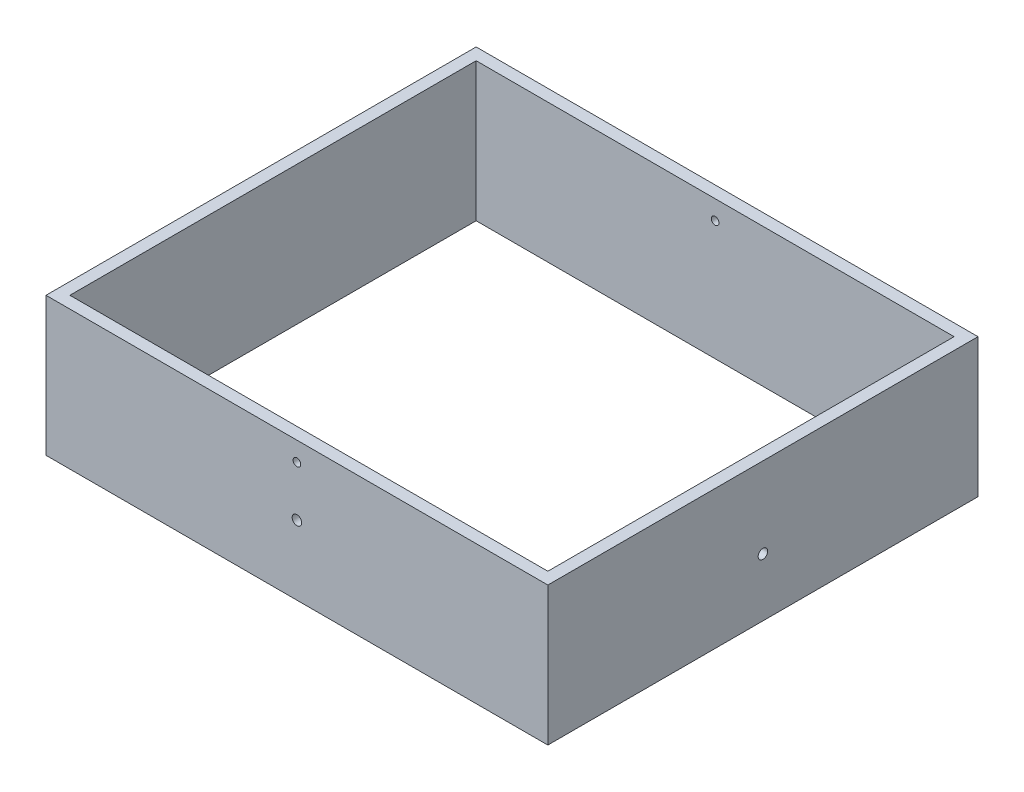
ISO-10303-21;
HEADER;
FILE_DESCRIPTION(('STEP AP214'),'2;1');
FILE_NAME('part.step','',(''),(''),'','','');
FILE_SCHEMA(('AUTOMOTIVE_DESIGN { 1 0 10303 214 1 1 1 1 }'));
ENDSEC;
DATA;
#1=APPLICATION_CONTEXT('core data for automotive mechanical design processes');
#2=APPLICATION_PROTOCOL_DEFINITION('international standard','automotive_design',2000,#1);
#3=PRODUCT_CONTEXT('',#1,'mechanical');
#4=PRODUCT('Part','Part','',(#3));
#5=PRODUCT_RELATED_PRODUCT_CATEGORY('part','',(#4));
#6=PRODUCT_DEFINITION_FORMATION('','',#4);
#7=PRODUCT_DEFINITION_CONTEXT('part definition',#1,'design');
#8=PRODUCT_DEFINITION('design','',#6,#7);
#9=PRODUCT_DEFINITION_SHAPE('','',#8);
#10=(LENGTH_UNIT() NAMED_UNIT(*) SI_UNIT(.MILLI.,.METRE.));
#11=(NAMED_UNIT(*) PLANE_ANGLE_UNIT() SI_UNIT($,.RADIAN.));
#12=(NAMED_UNIT(*) SI_UNIT($,.STERADIAN.) SOLID_ANGLE_UNIT());
#13=UNCERTAINTY_MEASURE_WITH_UNIT(LENGTH_MEASURE(1.E-05),#10,'distance_accuracy_value','');
#14=(GEOMETRIC_REPRESENTATION_CONTEXT(3) GLOBAL_UNCERTAINTY_ASSIGNED_CONTEXT((#13)) GLOBAL_UNIT_ASSIGNED_CONTEXT((#10,
#11,#12)) REPRESENTATION_CONTEXT('',''));
#15=CARTESIAN_POINT('',(0.,0.,0.));
#16=DIRECTION('',(0.,0.,1.));
#17=DIRECTION('',(1.,0.,0.));
#18=AXIS2_PLACEMENT_3D('',#15,#16,#17);
#19=CARTESIAN_POINT('',(0.,92.075,0.));
#20=DIRECTION('',(0.,1.,0.));
#21=DIRECTION('',(0.,0.,1.));
#22=AXIS2_PLACEMENT_3D('',#19,#20,#21);
#23=PLANE('',#22);
#24=DIRECTION('',(0.,0.,1.));
#25=VECTOR('',#24,1.);
#26=CARTESIAN_POINT('',(-118.999851079672,92.075,-72.9694434102755));
#27=LINE('',#26,#25);
#28=CARTESIAN_POINT('',(-118.999851079672,92.075,-72.9694434102755));
#29=VERTEX_POINT('',#28);
#30=CARTESIAN_POINT('',(-118.999851079672,92.075,212.780556589725));
#31=VERTEX_POINT('',#30);
#32=EDGE_CURVE('E155',#29,#31,#27,.T.);
#33=ORIENTED_EDGE('',*,*,#32,.T.);
#34=DIRECTION('',(1.,0.,0.));
#35=VECTOR('',#34,1.);
#36=CARTESIAN_POINT('',(-118.999851079672,92.075,212.780556589725));
#37=LINE('',#36,#35);
#38=CARTESIAN_POINT('',(214.375148920328,92.075,212.780556589725));
#39=VERTEX_POINT('',#38);
#40=EDGE_CURVE('E159',#31,#39,#37,.T.);
#41=ORIENTED_EDGE('',*,*,#40,.T.);
#42=DIRECTION('',(0.,0.,-1.));
#43=VECTOR('',#42,1.);
#44=CARTESIAN_POINT('',(214.375148920328,92.075,-72.9694434102755));
#45=LINE('',#44,#43);
#46=CARTESIAN_POINT('',(214.375148920328,92.075,-72.9694434102755));
#47=VERTEX_POINT('',#46);
#48=EDGE_CURVE('E163',#39,#47,#45,.T.);
#49=ORIENTED_EDGE('',*,*,#48,.T.);
#50=DIRECTION('',(-1.,0.,0.));
#51=VECTOR('',#50,1.);
#52=CARTESIAN_POINT('',(-118.999851079672,92.075,-72.9694434102755));
#53=LINE('',#52,#51);
#54=EDGE_CURVE('E166',#47,#29,#53,.T.);
#55=ORIENTED_EDGE('',*,*,#54,.T.);
#56=EDGE_LOOP('',(#33,#41,#49,#55));
#57=FACE_BOUND('',#56,.T.);
#58=DIRECTION('',(1.,0.,0.));
#59=VECTOR('',#58,1.);
#60=CARTESIAN_POINT('',(-111.062351079672,92.075,204.843056589725));
#61=LINE('',#60,#59);
#62=CARTESIAN_POINT('',(-111.062351079672,92.075,204.843056589725));
#63=VERTEX_POINT('',#62);
#64=CARTESIAN_POINT('',(206.437648920328,92.075,204.843056589725));
#65=VERTEX_POINT('',#64);
#66=EDGE_CURVE('E114',#63,#65,#61,.T.);
#67=ORIENTED_EDGE('',*,*,#66,.F.);
#68=DIRECTION('',(0.,0.,1.));
#69=VECTOR('',#68,1.);
#70=CARTESIAN_POINT('',(-111.062351079672,92.075,-65.0319434102755));
#71=LINE('',#70,#69);
#72=CARTESIAN_POINT('',(-111.062351079672,92.075,-65.0319434102755));
#73=VERTEX_POINT('',#72);
#74=EDGE_CURVE('E105',#73,#63,#71,.T.);
#75=ORIENTED_EDGE('',*,*,#74,.F.);
#76=DIRECTION('',(-1.,0.,0.));
#77=VECTOR('',#76,1.);
#78=CARTESIAN_POINT('',(-111.062351079672,92.075,-65.0319434102755));
#79=LINE('',#78,#77);
#80=CARTESIAN_POINT('',(206.437648920328,92.075,-65.0319434102755));
#81=VERTEX_POINT('',#80);
#82=EDGE_CURVE('E131',#81,#73,#79,.T.);
#83=ORIENTED_EDGE('',*,*,#82,.F.);
#84=DIRECTION('',(0.,0.,-1.));
#85=VECTOR('',#84,1.);
#86=CARTESIAN_POINT('',(206.437648920328,92.075,-65.0319434102755));
#87=LINE('',#86,#85);
#88=EDGE_CURVE('E127',#65,#81,#87,.T.);
#89=ORIENTED_EDGE('',*,*,#88,.F.);
#90=EDGE_LOOP('',(#67,#75,#83,#89));
#91=FACE_BOUND('',#90,.T.);
#92=ADVANCED_FACE('F38',(#57,#91),#23,.T.);
#93=CARTESIAN_POINT('',(0.,0.,0.));
#94=DIRECTION('',(0.,1.,0.));
#95=DIRECTION('',(0.,0.,1.));
#96=AXIS2_PLACEMENT_3D('',#93,#94,#95);
#97=PLANE('',#96);
#98=DIRECTION('',(0.,0.,1.));
#99=VECTOR('',#98,1.);
#100=CARTESIAN_POINT('',(-118.999851079672,0.,-72.9694434102755));
#101=LINE('',#100,#99);
#102=CARTESIAN_POINT('',(-118.999851079672,0.,-72.9694434102755));
#103=VERTEX_POINT('',#102);
#104=CARTESIAN_POINT('',(-118.999851079672,0.,212.780556589725));
#105=VERTEX_POINT('',#104);
#106=EDGE_CURVE('E123',#103,#105,#101,.T.);
#107=ORIENTED_EDGE('',*,*,#106,.F.);
#108=DIRECTION('',(-1.,0.,0.));
#109=VECTOR('',#108,1.);
#110=CARTESIAN_POINT('',(-118.999851079672,0.,-72.9694434102755));
#111=LINE('',#110,#109);
#112=CARTESIAN_POINT('',(214.375148920328,0.,-72.9694434102755));
#113=VERTEX_POINT('',#112);
#114=EDGE_CURVE('E160',#113,#103,#111,.T.);
#115=ORIENTED_EDGE('',*,*,#114,.F.);
#116=DIRECTION('',(0.,0.,-1.));
#117=VECTOR('',#116,1.);
#118=CARTESIAN_POINT('',(214.375148920328,0.,-72.9694434102755));
#119=LINE('',#118,#117);
#120=CARTESIAN_POINT('',(214.375148920328,0.,212.780556589725));
#121=VERTEX_POINT('',#120);
#122=EDGE_CURVE('E176',#121,#113,#119,.T.);
#123=ORIENTED_EDGE('',*,*,#122,.F.);
#124=DIRECTION('',(1.,0.,0.));
#125=VECTOR('',#124,1.);
#126=CARTESIAN_POINT('',(-118.999851079672,0.,212.780556589725));
#127=LINE('',#126,#125);
#128=EDGE_CURVE('E173',#105,#121,#127,.T.);
#129=ORIENTED_EDGE('',*,*,#128,.F.);
#130=EDGE_LOOP('',(#107,#115,#123,#129));
#131=FACE_BOUND('',#130,.T.);
#132=DIRECTION('',(0.,0.,1.));
#133=VECTOR('',#132,1.);
#134=CARTESIAN_POINT('',(-111.062351079672,0.,-65.0319434102755));
#135=LINE('',#134,#133);
#136=CARTESIAN_POINT('',(-111.062351079672,0.,-65.0319434102755));
#137=VERTEX_POINT('',#136);
#138=CARTESIAN_POINT('',(-111.062351079672,0.,204.843056589725));
#139=VERTEX_POINT('',#138);
#140=EDGE_CURVE('E63',#137,#139,#135,.T.);
#141=ORIENTED_EDGE('',*,*,#140,.T.);
#142=DIRECTION('',(1.,0.,0.));
#143=VECTOR('',#142,1.);
#144=CARTESIAN_POINT('',(-111.062351079672,0.,204.843056589725));
#145=LINE('',#144,#143);
#146=CARTESIAN_POINT('',(206.437648920328,0.,204.843056589725));
#147=VERTEX_POINT('',#146);
#148=EDGE_CURVE('E121',#139,#147,#145,.T.);
#149=ORIENTED_EDGE('',*,*,#148,.T.);
#150=DIRECTION('',(0.,0.,-1.));
#151=VECTOR('',#150,1.);
#152=CARTESIAN_POINT('',(206.437648920328,0.,-65.0319434102755));
#153=LINE('',#152,#151);
#154=CARTESIAN_POINT('',(206.437648920328,0.,-65.0319434102755));
#155=VERTEX_POINT('',#154);
#156=EDGE_CURVE('E142',#147,#155,#153,.T.);
#157=ORIENTED_EDGE('',*,*,#156,.T.);
#158=DIRECTION('',(-1.,0.,0.));
#159=VECTOR('',#158,1.);
#160=CARTESIAN_POINT('',(-111.062351079672,0.,-65.0319434102755));
#161=LINE('',#160,#159);
#162=EDGE_CURVE('E115',#155,#137,#161,.T.);
#163=ORIENTED_EDGE('',*,*,#162,.T.);
#164=EDGE_LOOP('',(#141,#149,#157,#163));
#165=FACE_BOUND('',#164,.T.);
#166=ADVANCED_FACE('F200',(#131,#165),#97,.F.);
#167=CARTESIAN_POINT('',(-118.999851079672,92.075,-72.9694434102755));
#168=DIRECTION('',(1.,0.,0.));
#169=DIRECTION('',(0.,0.,-1.));
#170=AXIS2_PLACEMENT_3D('',#167,#168,#169);
#171=PLANE('',#170);
#172=ORIENTED_EDGE('',*,*,#106,.T.);
#173=DIRECTION('',(0.,-1.,0.));
#174=VECTOR('',#173,1.);
#175=CARTESIAN_POINT('',(-118.999851079672,92.075,212.780556589725));
#176=LINE('',#175,#174);
#177=EDGE_CURVE('E11',#31,#105,#176,.T.);
#178=ORIENTED_EDGE('',*,*,#177,.F.);
#179=ORIENTED_EDGE('',*,*,#32,.F.);
#180=DIRECTION('',(0.,-1.,0.));
#181=VECTOR('',#180,1.);
#182=CARTESIAN_POINT('',(-118.999851079672,92.075,-72.9694434102755));
#183=LINE('',#182,#181);
#184=EDGE_CURVE('E169',#29,#103,#183,.T.);
#185=ORIENTED_EDGE('',*,*,#184,.T.);
#186=EDGE_LOOP('',(#172,#178,#179,#185));
#187=FACE_BOUND('',#186,.T.);
#188=ADVANCED_FACE('F40',(#187),#171,.F.);
#189=CARTESIAN_POINT('',(-118.999851079672,92.075,212.780556589725));
#190=DIRECTION('',(0.,0.,-1.));
#191=DIRECTION('',(-1.,0.,0.));
#192=AXIS2_PLACEMENT_3D('',#189,#190,#191);
#193=PLANE('',#192);
#194=CARTESIAN_POINT('',(47.6876489203276,46.0375,212.780556589725));
#195=DIRECTION('',(0.,0.,1.));
#196=DIRECTION('',(1.,0.,0.));
#197=AXIS2_PLACEMENT_3D('',#194,#195,#196);
#198=CIRCLE('',#197,3.175);
#199=CARTESIAN_POINT('',(50.8626489203276,46.0375,212.780556589725));
#200=VERTEX_POINT('',#199);
#201=EDGE_CURVE('E295',#200,#200,#198,.T.);
#202=ORIENTED_EDGE('',*,*,#201,.F.);
#203=EDGE_LOOP('',(#202));
#204=FACE_BOUND('',#203,.T.);
#205=CARTESIAN_POINT('',(47.6876489203276,79.375,212.780556589725));
#206=DIRECTION('',(0.,0.,1.));
#207=DIRECTION('',(1.,0.,0.));
#208=AXIS2_PLACEMENT_3D('',#205,#206,#207);
#209=CIRCLE('',#208,2.54);
#210=CARTESIAN_POINT('',(50.2276489203276,79.375,212.780556589725));
#211=VERTEX_POINT('',#210);
#212=EDGE_CURVE('E244',#211,#211,#209,.T.);
#213=ORIENTED_EDGE('',*,*,#212,.F.);
#214=EDGE_LOOP('',(#213));
#215=FACE_BOUND('',#214,.T.);
#216=ORIENTED_EDGE('',*,*,#128,.T.);
#217=DIRECTION('',(0.,-1.,0.));
#218=VECTOR('',#217,1.);
#219=CARTESIAN_POINT('',(214.375148920328,92.075,212.780556589725));
#220=LINE('',#219,#218);
#221=EDGE_CURVE('E48',#39,#121,#220,.T.);
#222=ORIENTED_EDGE('',*,*,#221,.F.);
#223=ORIENTED_EDGE('',*,*,#40,.F.);
#224=ORIENTED_EDGE('',*,*,#177,.T.);
#225=EDGE_LOOP('',(#216,#222,#223,#224));
#226=FACE_BOUND('',#225,.T.);
#227=ADVANCED_FACE('F210',(#204,#215,#226),#193,.F.);
#228=CARTESIAN_POINT('',(214.375148920328,92.075,-72.9694434102755));
#229=DIRECTION('',(-1.,0.,0.));
#230=DIRECTION('',(0.,0.,1.));
#231=AXIS2_PLACEMENT_3D('',#228,#229,#230);
#232=PLANE('',#231);
#233=CARTESIAN_POINT('',(214.375148920328,38.5595845822467,69.9055565897245));
#234=DIRECTION('',(1.,0.,0.));
#235=DIRECTION('',(0.,0.,-1.));
#236=AXIS2_PLACEMENT_3D('',#233,#234,#235);
#237=CIRCLE('',#236,3.175);
#238=CARTESIAN_POINT('',(214.375148920328,38.5595845822467,66.7305565897245));
#239=VERTEX_POINT('',#238);
#240=EDGE_CURVE('E290',#239,#239,#237,.T.);
#241=ORIENTED_EDGE('',*,*,#240,.F.);
#242=EDGE_LOOP('',(#241));
#243=FACE_BOUND('',#242,.T.);
#244=ORIENTED_EDGE('',*,*,#122,.T.);
#245=DIRECTION('',(0.,-1.,0.));
#246=VECTOR('',#245,1.);
#247=CARTESIAN_POINT('',(214.375148920328,92.075,-72.9694434102755));
#248=LINE('',#247,#246);
#249=EDGE_CURVE('E184',#47,#113,#248,.T.);
#250=ORIENTED_EDGE('',*,*,#249,.F.);
#251=ORIENTED_EDGE('',*,*,#48,.F.);
#252=ORIENTED_EDGE('',*,*,#221,.T.);
#253=EDGE_LOOP('',(#244,#250,#251,#252));
#254=FACE_BOUND('',#253,.T.);
#255=ADVANCED_FACE('F194',(#243,#254),#232,.F.);
#256=CARTESIAN_POINT('',(-118.999851079672,92.075,-72.9694434102755));
#257=DIRECTION('',(0.,0.,1.));
#258=DIRECTION('',(1.,0.,0.));
#259=AXIS2_PLACEMENT_3D('',#256,#257,#258);
#260=PLANE('',#259);
#261=CARTESIAN_POINT('',(47.6876489203276,79.375,-72.9694434102755));
#262=DIRECTION('',(0.,0.,1.));
#263=DIRECTION('',(1.,0.,0.));
#264=AXIS2_PLACEMENT_3D('',#261,#262,#263);
#265=CIRCLE('',#264,2.54);
#266=CARTESIAN_POINT('',(50.2276489203276,79.375,-72.9694434102755));
#267=VERTEX_POINT('',#266);
#268=EDGE_CURVE('E241',#267,#267,#265,.T.);
#269=ORIENTED_EDGE('',*,*,#268,.T.);
#270=EDGE_LOOP('',(#269));
#271=FACE_BOUND('',#270,.T.);
#272=ORIENTED_EDGE('',*,*,#114,.T.);
#273=ORIENTED_EDGE('',*,*,#184,.F.);
#274=ORIENTED_EDGE('',*,*,#54,.F.);
#275=ORIENTED_EDGE('',*,*,#249,.T.);
#276=EDGE_LOOP('',(#272,#273,#274,#275));
#277=FACE_BOUND('',#276,.T.);
#278=ADVANCED_FACE('F204',(#271,#277),#260,.F.);
#279=CARTESIAN_POINT('',(-111.062351079672,92.075,-65.0319434102755));
#280=DIRECTION('',(1.,0.,0.));
#281=DIRECTION('',(0.,0.,-1.));
#282=AXIS2_PLACEMENT_3D('',#279,#280,#281);
#283=PLANE('',#282);
#284=ORIENTED_EDGE('',*,*,#140,.F.);
#285=DIRECTION('',(0.,-1.,0.));
#286=VECTOR('',#285,1.);
#287=CARTESIAN_POINT('',(-111.062351079672,92.075,-65.0319434102755));
#288=LINE('',#287,#286);
#289=EDGE_CURVE('E109',#73,#137,#288,.T.);
#290=ORIENTED_EDGE('',*,*,#289,.F.);
#291=ORIENTED_EDGE('',*,*,#74,.T.);
#292=DIRECTION('',(0.,-1.,0.));
#293=VECTOR('',#292,1.);
#294=CARTESIAN_POINT('',(-111.062351079672,92.075,204.843056589725));
#295=LINE('',#294,#293);
#296=EDGE_CURVE('E108',#63,#139,#295,.T.);
#297=ORIENTED_EDGE('',*,*,#296,.T.);
#298=EDGE_LOOP('',(#284,#290,#291,#297));
#299=FACE_BOUND('',#298,.T.);
#300=ADVANCED_FACE('F107',(#299),#283,.T.);
#301=CARTESIAN_POINT('',(-111.062351079672,92.075,204.843056589725));
#302=DIRECTION('',(0.,0.,-1.));
#303=DIRECTION('',(-1.,0.,0.));
#304=AXIS2_PLACEMENT_3D('',#301,#302,#303);
#305=PLANE('',#304);
#306=CARTESIAN_POINT('',(47.6876489203276,46.0375,204.843056589725));
#307=DIRECTION('',(0.,0.,-1.));
#308=DIRECTION('',(-1.,0.,0.));
#309=AXIS2_PLACEMENT_3D('',#306,#307,#308);
#310=CIRCLE('',#309,3.175);
#311=CARTESIAN_POINT('',(44.5126489203276,46.0375,204.843056589725));
#312=VERTEX_POINT('',#311);
#313=EDGE_CURVE('E250',#312,#312,#310,.F.);
#314=ORIENTED_EDGE('',*,*,#313,.T.);
#315=EDGE_LOOP('',(#314));
#316=FACE_BOUND('',#315,.T.);
#317=CARTESIAN_POINT('',(47.6876489203276,79.375,204.843056589725));
#318=DIRECTION('',(0.,0.,-1.));
#319=DIRECTION('',(-1.,0.,0.));
#320=AXIS2_PLACEMENT_3D('',#317,#318,#319);
#321=CIRCLE('',#320,2.54);
#322=CARTESIAN_POINT('',(45.1476489203276,79.375,204.843056589725));
#323=VERTEX_POINT('',#322);
#324=EDGE_CURVE('E139',#323,#323,#321,.T.);
#325=ORIENTED_EDGE('',*,*,#324,.F.);
#326=EDGE_LOOP('',(#325));
#327=FACE_BOUND('',#326,.T.);
#328=ORIENTED_EDGE('',*,*,#148,.F.);
#329=ORIENTED_EDGE('',*,*,#296,.F.);
#330=ORIENTED_EDGE('',*,*,#66,.T.);
#331=DIRECTION('',(0.,-1.,0.));
#332=VECTOR('',#331,1.);
#333=CARTESIAN_POINT('',(206.437648920328,92.075,204.843056589725));
#334=LINE('',#333,#332);
#335=EDGE_CURVE('E124',#65,#147,#334,.T.);
#336=ORIENTED_EDGE('',*,*,#335,.T.);
#337=EDGE_LOOP('',(#328,#329,#330,#336));
#338=FACE_BOUND('',#337,.T.);
#339=ADVANCED_FACE('F118',(#316,#327,#338),#305,.T.);
#340=CARTESIAN_POINT('',(206.437648920328,92.075,-65.0319434102755));
#341=DIRECTION('',(-1.,0.,0.));
#342=DIRECTION('',(0.,0.,1.));
#343=AXIS2_PLACEMENT_3D('',#340,#341,#342);
#344=PLANE('',#343);
#345=CARTESIAN_POINT('',(206.437648920328,38.5595845822467,69.9055565897245));
#346=DIRECTION('',(-1.,0.,0.));
#347=DIRECTION('',(0.,0.,1.));
#348=AXIS2_PLACEMENT_3D('',#345,#346,#347);
#349=CIRCLE('',#348,3.175);
#350=CARTESIAN_POINT('',(206.437648920328,38.5595845822467,73.0805565897245));
#351=VERTEX_POINT('',#350);
#352=EDGE_CURVE('E293',#351,#351,#349,.F.);
#353=ORIENTED_EDGE('',*,*,#352,.T.);
#354=EDGE_LOOP('',(#353));
#355=FACE_BOUND('',#354,.T.);
#356=ORIENTED_EDGE('',*,*,#156,.F.);
#357=ORIENTED_EDGE('',*,*,#335,.F.);
#358=ORIENTED_EDGE('',*,*,#88,.T.);
#359=DIRECTION('',(0.,-1.,0.));
#360=VECTOR('',#359,1.);
#361=CARTESIAN_POINT('',(206.437648920328,92.075,-65.0319434102755));
#362=LINE('',#361,#360);
#363=EDGE_CURVE('E55',#81,#155,#362,.T.);
#364=ORIENTED_EDGE('',*,*,#363,.T.);
#365=EDGE_LOOP('',(#356,#357,#358,#364));
#366=FACE_BOUND('',#365,.T.);
#367=ADVANCED_FACE('F261',(#355,#366),#344,.T.);
#368=CARTESIAN_POINT('',(-111.062351079672,92.075,-65.0319434102755));
#369=DIRECTION('',(0.,0.,1.));
#370=DIRECTION('',(1.,0.,0.));
#371=AXIS2_PLACEMENT_3D('',#368,#369,#370);
#372=PLANE('',#371);
#373=CARTESIAN_POINT('',(47.6876489203276,79.375,-65.0319434102755));
#374=DIRECTION('',(0.,0.,1.));
#375=DIRECTION('',(1.,0.,0.));
#376=AXIS2_PLACEMENT_3D('',#373,#374,#375);
#377=CIRCLE('',#376,2.54);
#378=CARTESIAN_POINT('',(50.2276489203276,79.375,-65.0319434102755));
#379=VERTEX_POINT('',#378);
#380=EDGE_CURVE('E42',#379,#379,#377,.T.);
#381=ORIENTED_EDGE('',*,*,#380,.F.);
#382=EDGE_LOOP('',(#381));
#383=FACE_BOUND('',#382,.T.);
#384=ORIENTED_EDGE('',*,*,#162,.F.);
#385=ORIENTED_EDGE('',*,*,#363,.F.);
#386=ORIENTED_EDGE('',*,*,#82,.T.);
#387=ORIENTED_EDGE('',*,*,#289,.T.);
#388=EDGE_LOOP('',(#384,#385,#386,#387));
#389=FACE_BOUND('',#388,.T.);
#390=ADVANCED_FACE('F267',(#383,#389),#372,.T.);
#391=CARTESIAN_POINT('',(47.6876489203276,79.375,-72.9694434102755));
#392=DIRECTION('',(0.,0.,1.));
#393=DIRECTION('',(1.,0.,0.));
#394=AXIS2_PLACEMENT_3D('',#391,#392,#393);
#395=CYLINDRICAL_SURFACE('',#394,2.54);
#396=ORIENTED_EDGE('',*,*,#380,.T.);
#397=EDGE_LOOP('',(#396));
#398=FACE_BOUND('',#397,.T.);
#399=ORIENTED_EDGE('',*,*,#268,.F.);
#400=EDGE_LOOP('',(#399));
#401=FACE_BOUND('',#400,.T.);
#402=ADVANCED_FACE('F273',(#398,#401),#395,.F.);
#403=ORIENTED_EDGE('',*,*,#324,.T.);
#404=EDGE_LOOP('',(#403));
#405=FACE_BOUND('',#404,.T.);
#406=ORIENTED_EDGE('',*,*,#212,.T.);
#407=EDGE_LOOP('',(#406));
#408=FACE_BOUND('',#407,.T.);
#409=ADVANCED_FACE('F258',(#405,#408),#395,.F.);
#410=CARTESIAN_POINT('',(47.6876489203276,46.0375,195.862800468655));
#411=DIRECTION('',(0.,0.,1.));
#412=DIRECTION('',(1.,0.,0.));
#413=AXIS2_PLACEMENT_3D('',#410,#411,#412);
#414=CYLINDRICAL_SURFACE('',#413,3.175);
#415=ORIENTED_EDGE('',*,*,#201,.T.);
#416=EDGE_LOOP('',(#415));
#417=FACE_BOUND('',#416,.T.);
#418=ORIENTED_EDGE('',*,*,#313,.F.);
#419=EDGE_LOOP('',(#418));
#420=FACE_BOUND('',#419,.T.);
#421=ADVANCED_FACE('F278',(#417,#420),#414,.F.);
#422=CARTESIAN_POINT('',(197.457392799258,38.5595845822467,69.9055565897245));
#423=DIRECTION('',(1.,0.,0.));
#424=DIRECTION('',(0.,0.,-1.));
#425=AXIS2_PLACEMENT_3D('',#422,#423,#424);
#426=CYLINDRICAL_SURFACE('',#425,3.175);
#427=ORIENTED_EDGE('',*,*,#240,.T.);
#428=EDGE_LOOP('',(#427));
#429=FACE_BOUND('',#428,.T.);
#430=ORIENTED_EDGE('',*,*,#352,.F.);
#431=EDGE_LOOP('',(#430));
#432=FACE_BOUND('',#431,.T.);
#433=ADVANCED_FACE('F281',(#429,#432),#426,.F.);
#434=CLOSED_SHELL('',(#92,#166,#188,#227,#255,#278,#300,#339,#367,#390,#402,#409,#421,#433));
#435=MANIFOLD_SOLID_BREP('B2',#434);
#436=ADVANCED_BREP_SHAPE_REPRESENTATION('',(#18,#435),#14);
#437=SHAPE_DEFINITION_REPRESENTATION(#9,#436);
ENDSEC;
END-ISO-10303-21;
